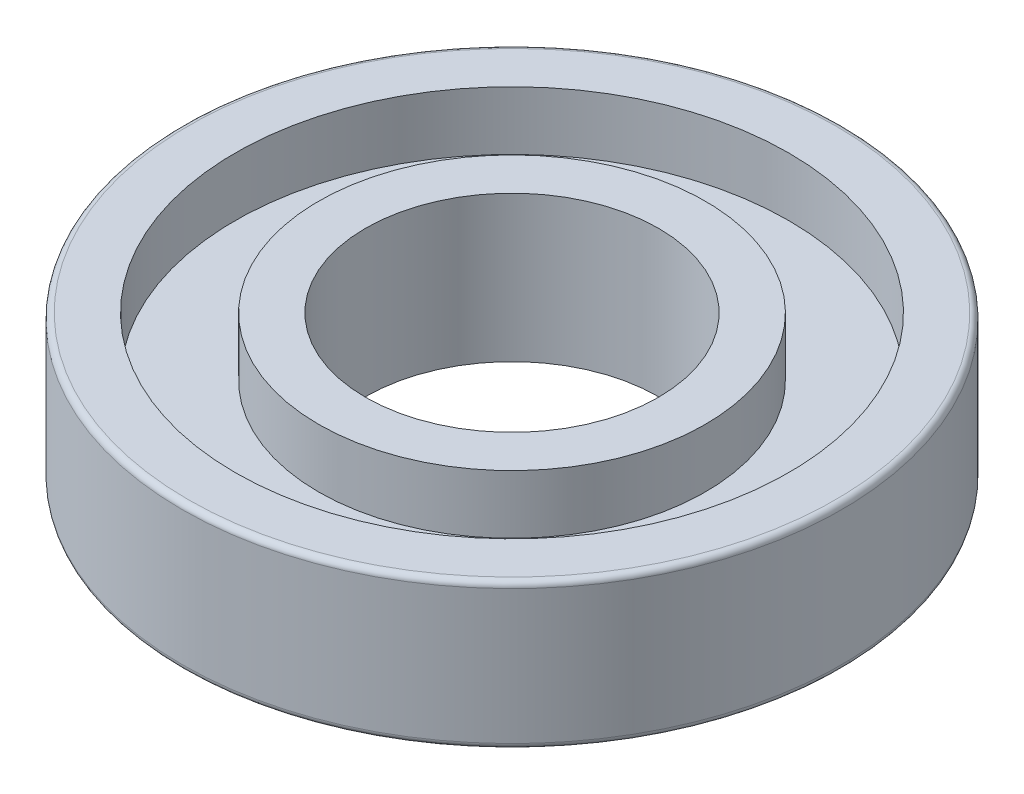
ISO-10303-21;
HEADER;
FILE_DESCRIPTION(('STEP AP214'),'2;1');
FILE_NAME('part.step','',(''),(''),'','','');
FILE_SCHEMA(('AUTOMOTIVE_DESIGN { 1 0 10303 214 1 1 1 1 }'));
ENDSEC;
DATA;
#1=APPLICATION_CONTEXT('core data for automotive mechanical design processes');
#2=APPLICATION_PROTOCOL_DEFINITION('international standard','automotive_design',2000,#1);
#3=PRODUCT_CONTEXT('',#1,'mechanical');
#4=PRODUCT('Part','Part','',(#3));
#5=PRODUCT_RELATED_PRODUCT_CATEGORY('part','',(#4));
#6=PRODUCT_DEFINITION_FORMATION('','',#4);
#7=PRODUCT_DEFINITION_CONTEXT('part definition',#1,'design');
#8=PRODUCT_DEFINITION('design','',#6,#7);
#9=PRODUCT_DEFINITION_SHAPE('','',#8);
#10=(LENGTH_UNIT() NAMED_UNIT(*) SI_UNIT(.MILLI.,.METRE.));
#11=(NAMED_UNIT(*) PLANE_ANGLE_UNIT() SI_UNIT($,.RADIAN.));
#12=(NAMED_UNIT(*) SI_UNIT($,.STERADIAN.) SOLID_ANGLE_UNIT());
#13=UNCERTAINTY_MEASURE_WITH_UNIT(LENGTH_MEASURE(1.E-05),#10,'distance_accuracy_value','');
#14=(GEOMETRIC_REPRESENTATION_CONTEXT(3) GLOBAL_UNCERTAINTY_ASSIGNED_CONTEXT((#13)) GLOBAL_UNIT_ASSIGNED_CONTEXT((#10,
#11,#12)) REPRESENTATION_CONTEXT('',''));
#15=CARTESIAN_POINT('',(0.,0.,0.));
#16=DIRECTION('',(0.,0.,1.));
#17=DIRECTION('',(1.,0.,0.));
#18=AXIS2_PLACEMENT_3D('',#15,#16,#17);
#19=CARTESIAN_POINT('',(0.,6.3246,0.));
#20=DIRECTION('',(0.,-1.,0.));
#21=DIRECTION('',(0.,0.,-1.));
#22=AXIS2_PLACEMENT_3D('',#19,#20,#21);
#23=CYLINDRICAL_SURFACE('',#22,6.35);
#24=CARTESIAN_POINT('',(0.,0.,0.));
#25=DIRECTION('',(0.,-1.,0.));
#26=DIRECTION('',(0.,0.,-1.));
#27=AXIS2_PLACEMENT_3D('',#24,#25,#26);
#28=CIRCLE('',#27,6.35);
#29=CARTESIAN_POINT('',(0.,0.,-6.35));
#30=VERTEX_POINT('',#29);
#31=EDGE_CURVE('E321',#30,#30,#28,.T.);
#32=ORIENTED_EDGE('',*,*,#31,.T.);
#33=EDGE_LOOP('',(#32));
#34=FACE_BOUND('',#33,.T.);
#35=CARTESIAN_POINT('',(0.,6.3246,0.));
#36=DIRECTION('',(0.,-1.,0.));
#37=DIRECTION('',(0.,0.,-1.));
#38=AXIS2_PLACEMENT_3D('',#35,#36,#37);
#39=CIRCLE('',#38,6.35);
#40=CARTESIAN_POINT('',(0.,6.3246,-6.35));
#41=VERTEX_POINT('',#40);
#42=EDGE_CURVE('E324',#41,#41,#39,.T.);
#43=ORIENTED_EDGE('',*,*,#42,.F.);
#44=EDGE_LOOP('',(#43));
#45=FACE_BOUND('',#44,.T.);
#46=ADVANCED_FACE('F16',(#34,#45),#23,.F.);
#47=CARTESIAN_POINT('',(0.,6.3246,0.));
#48=DIRECTION('',(0.,1.,0.));
#49=DIRECTION('',(0.,0.,1.));
#50=AXIS2_PLACEMENT_3D('',#47,#48,#49);
#51=PLANE('',#50);
#52=CARTESIAN_POINT('',(0.,6.3246,0.));
#53=DIRECTION('',(0.,1.,0.));
#54=DIRECTION('',(0.,0.,1.));
#55=AXIS2_PLACEMENT_3D('',#52,#53,#54);
#56=CIRCLE('',#55,8.382);
#57=CARTESIAN_POINT('',(0.,6.3246,8.382));
#58=VERTEX_POINT('',#57);
#59=EDGE_CURVE('E318',#58,#58,#56,.F.);
#60=ORIENTED_EDGE('',*,*,#59,.F.);
#61=EDGE_LOOP('',(#60));
#62=FACE_BOUND('',#61,.T.);
#63=ORIENTED_EDGE('',*,*,#42,.T.);
#64=EDGE_LOOP('',(#63));
#65=FACE_BOUND('',#64,.T.);
#66=ADVANCED_FACE('F150',(#62,#65),#51,.T.);
#67=CARTESIAN_POINT('',(0.,0.,0.));
#68=DIRECTION('',(0.,1.,0.));
#69=DIRECTION('',(0.,0.,1.));
#70=AXIS2_PLACEMENT_3D('',#67,#68,#69);
#71=PLANE('',#70);
#72=CARTESIAN_POINT('',(0.,0.,0.));
#73=DIRECTION('',(0.,-1.,0.));
#74=DIRECTION('',(0.,0.,-1.));
#75=AXIS2_PLACEMENT_3D('',#72,#73,#74);
#76=CIRCLE('',#75,8.382);
#77=CARTESIAN_POINT('',(0.,0.,-8.382));
#78=VERTEX_POINT('',#77);
#79=EDGE_CURVE('E315',#78,#78,#76,.F.);
#80=ORIENTED_EDGE('',*,*,#79,.F.);
#81=EDGE_LOOP('',(#80));
#82=FACE_BOUND('',#81,.T.);
#83=ORIENTED_EDGE('',*,*,#31,.F.);
#84=EDGE_LOOP('',(#83));
#85=FACE_BOUND('',#84,.T.);
#86=ADVANCED_FACE('F147',(#82,#85),#71,.F.);
#87=CARTESIAN_POINT('',(0.,3.7846,0.));
#88=DIRECTION('',(0.,1.,0.));
#89=DIRECTION('',(0.,0.,1.));
#90=AXIS2_PLACEMENT_3D('',#87,#88,#89);
#91=CYLINDRICAL_SURFACE('',#90,8.382);
#92=CARTESIAN_POINT('',(0.,3.7846,0.));
#93=DIRECTION('',(0.,1.,0.));
#94=DIRECTION('',(0.,0.,1.));
#95=AXIS2_PLACEMENT_3D('',#92,#93,#94);
#96=CIRCLE('',#95,8.382);
#97=CARTESIAN_POINT('',(0.,3.7846,8.382));
#98=VERTEX_POINT('',#97);
#99=EDGE_CURVE('E312',#98,#98,#96,.F.);
#100=ORIENTED_EDGE('',*,*,#99,.F.);
#101=EDGE_LOOP('',(#100));
#102=FACE_BOUND('',#101,.T.);
#103=ORIENTED_EDGE('',*,*,#59,.T.);
#104=EDGE_LOOP('',(#103));
#105=FACE_BOUND('',#104,.T.);
#106=ADVANCED_FACE('F143',(#102,#105),#91,.T.);
#107=CARTESIAN_POINT('',(0.,2.54,0.));
#108=DIRECTION('',(0.,-1.,0.));
#109=DIRECTION('',(0.,0.,-1.));
#110=AXIS2_PLACEMENT_3D('',#107,#108,#109);
#111=CYLINDRICAL_SURFACE('',#110,8.382);
#112=CARTESIAN_POINT('',(0.,2.54,0.));
#113=DIRECTION('',(0.,-1.,0.));
#114=DIRECTION('',(0.,0.,-1.));
#115=AXIS2_PLACEMENT_3D('',#112,#113,#114);
#116=CIRCLE('',#115,8.382);
#117=CARTESIAN_POINT('',(0.,2.54,-8.382));
#118=VERTEX_POINT('',#117);
#119=EDGE_CURVE('E309',#118,#118,#116,.F.);
#120=ORIENTED_EDGE('',*,*,#119,.F.);
#121=EDGE_LOOP('',(#120));
#122=FACE_BOUND('',#121,.T.);
#123=ORIENTED_EDGE('',*,*,#79,.T.);
#124=EDGE_LOOP('',(#123));
#125=FACE_BOUND('',#124,.T.);
#126=ADVANCED_FACE('F139',(#122,#125),#111,.T.);
#127=CARTESIAN_POINT('',(0.,3.7846,0.));
#128=DIRECTION('',(0.,1.,0.));
#129=DIRECTION('',(0.,0.,1.));
#130=AXIS2_PLACEMENT_3D('',#127,#128,#129);
#131=PLANE('',#130);
#132=CARTESIAN_POINT('',(0.,3.7846,0.));
#133=DIRECTION('',(0.,1.,0.));
#134=DIRECTION('',(0.,0.,1.));
#135=AXIS2_PLACEMENT_3D('',#132,#133,#134);
#136=CIRCLE('',#135,12.0015);
#137=CARTESIAN_POINT('',(0.,3.7846,12.0015));
#138=VERTEX_POINT('',#137);
#139=EDGE_CURVE('E306',#138,#138,#136,.T.);
#140=ORIENTED_EDGE('',*,*,#139,.T.);
#141=EDGE_LOOP('',(#140));
#142=FACE_BOUND('',#141,.T.);
#143=ORIENTED_EDGE('',*,*,#99,.T.);
#144=EDGE_LOOP('',(#143));
#145=FACE_BOUND('',#144,.T.);
#146=ADVANCED_FACE('F135',(#142,#145),#131,.T.);
#147=CARTESIAN_POINT('',(0.,2.54,0.));
#148=DIRECTION('',(0.,-1.,0.));
#149=DIRECTION('',(0.,0.,-1.));
#150=AXIS2_PLACEMENT_3D('',#147,#148,#149);
#151=PLANE('',#150);
#152=CARTESIAN_POINT('',(0.,2.54,0.));
#153=DIRECTION('',(0.,-1.,0.));
#154=DIRECTION('',(0.,0.,-1.));
#155=AXIS2_PLACEMENT_3D('',#152,#153,#154);
#156=CIRCLE('',#155,12.0015);
#157=CARTESIAN_POINT('',(0.,2.54,-12.0015));
#158=VERTEX_POINT('',#157);
#159=EDGE_CURVE('E301',#158,#158,#156,.T.);
#160=ORIENTED_EDGE('',*,*,#159,.T.);
#161=EDGE_LOOP('',(#160));
#162=FACE_BOUND('',#161,.T.);
#163=ORIENTED_EDGE('',*,*,#119,.T.);
#164=EDGE_LOOP('',(#163));
#165=FACE_BOUND('',#164,.T.);
#166=ADVANCED_FACE('F131',(#162,#165),#151,.T.);
#167=CARTESIAN_POINT('',(0.,3.7846,0.));
#168=DIRECTION('',(0.,1.,0.));
#169=DIRECTION('',(0.,0.,1.));
#170=AXIS2_PLACEMENT_3D('',#167,#168,#169);
#171=CYLINDRICAL_SURFACE('',#170,12.0015);
#172=CARTESIAN_POINT('',(0.,6.3246,0.));
#173=DIRECTION('',(0.,1.,0.));
#174=DIRECTION('',(0.,0.,1.));
#175=AXIS2_PLACEMENT_3D('',#172,#173,#174);
#176=CIRCLE('',#175,12.0015);
#177=CARTESIAN_POINT('',(0.,6.3246,12.0015));
#178=VERTEX_POINT('',#177);
#179=EDGE_CURVE('E299',#178,#178,#176,.F.);
#180=ORIENTED_EDGE('',*,*,#179,.F.);
#181=EDGE_LOOP('',(#180));
#182=FACE_BOUND('',#181,.T.);
#183=ORIENTED_EDGE('',*,*,#139,.F.);
#184=EDGE_LOOP('',(#183));
#185=FACE_BOUND('',#184,.T.);
#186=ADVANCED_FACE('F127',(#182,#185),#171,.F.);
#187=CARTESIAN_POINT('',(0.,2.54,0.));
#188=DIRECTION('',(0.,-1.,0.));
#189=DIRECTION('',(0.,0.,-1.));
#190=AXIS2_PLACEMENT_3D('',#187,#188,#189);
#191=CYLINDRICAL_SURFACE('',#190,12.0015);
#192=ORIENTED_EDGE('',*,*,#159,.F.);
#193=EDGE_LOOP('',(#192));
#194=FACE_BOUND('',#193,.T.);
#195=CARTESIAN_POINT('',(0.,0.,0.));
#196=DIRECTION('',(0.,-1.,0.));
#197=DIRECTION('',(0.,0.,-1.));
#198=AXIS2_PLACEMENT_3D('',#195,#196,#197);
#199=CIRCLE('',#198,12.0015);
#200=CARTESIAN_POINT('',(0.,0.,-12.0015));
#201=VERTEX_POINT('',#200);
#202=EDGE_CURVE('E51',#201,#201,#199,.T.);
#203=ORIENTED_EDGE('',*,*,#202,.T.);
#204=EDGE_LOOP('',(#203));
#205=FACE_BOUND('',#204,.T.);
#206=ADVANCED_FACE('F122',(#194,#205),#191,.F.);
#207=CARTESIAN_POINT('',(0.,6.3246,0.));
#208=DIRECTION('',(0.,1.,0.));
#209=DIRECTION('',(0.,0.,1.));
#210=AXIS2_PLACEMENT_3D('',#207,#208,#209);
#211=PLANE('',#210);
#212=ORIENTED_EDGE('',*,*,#179,.T.);
#213=EDGE_LOOP('',(#212));
#214=FACE_BOUND('',#213,.T.);
#215=CARTESIAN_POINT('',(0.,6.3246,0.));
#216=DIRECTION('',(0.,-1.,0.));
#217=DIRECTION('',(0.,0.,-1.));
#218=AXIS2_PLACEMENT_3D('',#215,#216,#217);
#219=CIRCLE('',#218,14.0335);
#220=CARTESIAN_POINT('',(0.,6.3246,-14.0335));
#221=VERTEX_POINT('',#220);
#222=CARTESIAN_POINT('',(0.,6.3246,14.0335));
#223=VERTEX_POINT('',#222);
#224=EDGE_CURVE('E49',#221,#223,#219,.T.);
#225=ORIENTED_EDGE('',*,*,#224,.F.);
#226=CARTESIAN_POINT('',(0.,6.3246,0.));
#227=DIRECTION('',(0.,-1.,0.));
#228=DIRECTION('',(0.,0.,1.));
#229=AXIS2_PLACEMENT_3D('',#226,#227,#228);
#230=CIRCLE('',#229,14.0335);
#231=EDGE_CURVE('E44',#223,#221,#230,.T.);
#232=ORIENTED_EDGE('',*,*,#231,.F.);
#233=EDGE_LOOP('',(#225,#232));
#234=FACE_BOUND('',#233,.T.);
#235=ADVANCED_FACE('F48',(#214,#234),#211,.T.);
#236=CARTESIAN_POINT('',(0.,0.,0.));
#237=DIRECTION('',(0.,1.,0.));
#238=DIRECTION('',(0.,0.,1.));
#239=AXIS2_PLACEMENT_3D('',#236,#237,#238);
#240=PLANE('',#239);
#241=ORIENTED_EDGE('',*,*,#202,.F.);
#242=EDGE_LOOP('',(#241));
#243=FACE_BOUND('',#242,.T.);
#244=CARTESIAN_POINT('',(0.,0.,0.));
#245=DIRECTION('',(0.,1.,0.));
#246=DIRECTION('',(0.,0.,1.));
#247=AXIS2_PLACEMENT_3D('',#244,#245,#246);
#248=CIRCLE('',#247,14.0335);
#249=CARTESIAN_POINT('',(0.,0.,14.0335));
#250=VERTEX_POINT('',#249);
#251=CARTESIAN_POINT('',(0.,0.,-14.0335));
#252=VERTEX_POINT('',#251);
#253=EDGE_CURVE('E57',#250,#252,#248,.T.);
#254=ORIENTED_EDGE('',*,*,#253,.F.);
#255=CARTESIAN_POINT('',(0.,0.,0.));
#256=DIRECTION('',(0.,1.,0.));
#257=DIRECTION('',(0.,0.,-1.));
#258=AXIS2_PLACEMENT_3D('',#255,#256,#257);
#259=CIRCLE('',#258,14.0335);
#260=EDGE_CURVE('E35',#252,#250,#259,.T.);
#261=ORIENTED_EDGE('',*,*,#260,.F.);
#262=EDGE_LOOP('',(#254,#261));
#263=FACE_BOUND('',#262,.T.);
#264=ADVANCED_FACE('F77',(#243,#263),#240,.F.);
#265=CARTESIAN_POINT('',(0.,6.0706,0.));
#266=DIRECTION('',(0.,1.,0.));
#267=DIRECTION('',(0.,0.,1.));
#268=AXIS2_PLACEMENT_3D('',#265,#266,#267);
#269=TOROIDAL_SURFACE('',#268,14.0335,0.254);
#270=ORIENTED_EDGE('',*,*,#231,.T.);
#271=ORIENTED_EDGE('',*,*,#224,.T.);
#272=EDGE_LOOP('',(#270,#271));
#273=FACE_BOUND('',#272,.T.);
#274=CARTESIAN_POINT('',(0.,6.0706,0.));
#275=DIRECTION('',(0.,-1.,0.));
#276=DIRECTION('',(0.,0.,-1.));
#277=AXIS2_PLACEMENT_3D('',#274,#275,#276);
#278=CIRCLE('',#277,14.2875);
#279=CARTESIAN_POINT('',(0.,6.0706,-14.2875));
#280=VERTEX_POINT('',#279);
#281=EDGE_CURVE('E27',#280,#280,#278,.T.);
#282=ORIENTED_EDGE('',*,*,#281,.F.);
#283=EDGE_LOOP('',(#282));
#284=FACE_BOUND('',#283,.T.);
#285=ADVANCED_FACE('F55',(#273,#284),#269,.T.);
#286=CARTESIAN_POINT('',(0.,0.254,0.));
#287=DIRECTION('',(0.,1.,0.));
#288=DIRECTION('',(0.,0.,1.));
#289=AXIS2_PLACEMENT_3D('',#286,#287,#288);
#290=TOROIDAL_SURFACE('',#289,14.0335,0.254);
#291=CARTESIAN_POINT('',(0.,0.254,0.));
#292=DIRECTION('',(0.,-1.,0.));
#293=DIRECTION('',(0.,0.,-1.));
#294=AXIS2_PLACEMENT_3D('',#291,#292,#293);
#295=CIRCLE('',#294,14.2875);
#296=CARTESIAN_POINT('',(0.,0.254,-14.2875));
#297=VERTEX_POINT('',#296);
#298=EDGE_CURVE('E11',#297,#297,#295,.F.);
#299=ORIENTED_EDGE('',*,*,#298,.F.);
#300=EDGE_LOOP('',(#299));
#301=FACE_BOUND('',#300,.T.);
#302=ORIENTED_EDGE('',*,*,#253,.T.);
#303=ORIENTED_EDGE('',*,*,#260,.T.);
#304=EDGE_LOOP('',(#302,#303));
#305=FACE_BOUND('',#304,.T.);
#306=ADVANCED_FACE('F76',(#301,#305),#290,.T.);
#307=CARTESIAN_POINT('',(0.,6.3246,0.));
#308=DIRECTION('',(0.,-1.,0.));
#309=DIRECTION('',(0.,0.,-1.));
#310=AXIS2_PLACEMENT_3D('',#307,#308,#309);
#311=CYLINDRICAL_SURFACE('',#310,14.2875);
#312=ORIENTED_EDGE('',*,*,#298,.T.);
#313=EDGE_LOOP('',(#312));
#314=FACE_BOUND('',#313,.T.);
#315=ORIENTED_EDGE('',*,*,#281,.T.);
#316=EDGE_LOOP('',(#315));
#317=FACE_BOUND('',#316,.T.);
#318=ADVANCED_FACE('F161',(#314,#317),#311,.T.);
#319=CLOSED_SHELL('',(#46,#66,#86,#106,#126,#146,#166,#186,#206,#235,#264,#285,#306,#318));
#320=MANIFOLD_SOLID_BREP('B1',#319);
#321=ADVANCED_BREP_SHAPE_REPRESENTATION('',(#18,#320),#14);
#322=SHAPE_DEFINITION_REPRESENTATION(#9,#321);
ENDSEC;
END-ISO-10303-21;
